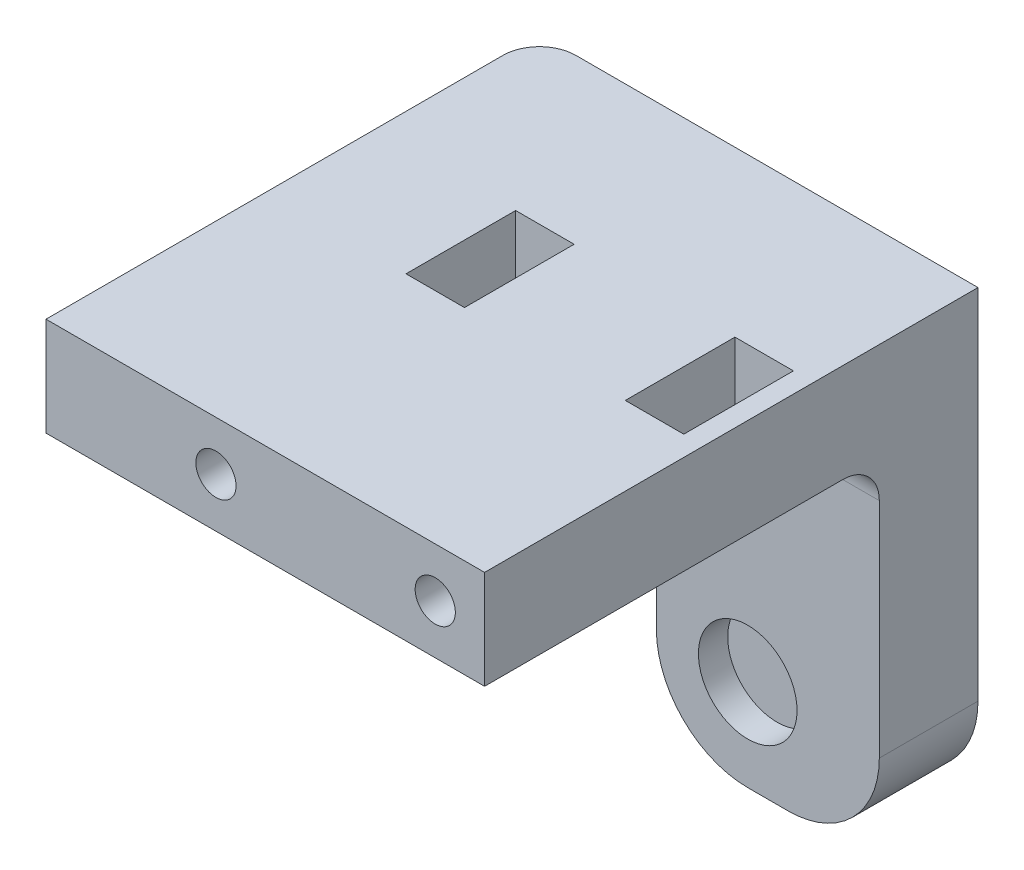
ISO-10303-21;
HEADER;
FILE_DESCRIPTION(('STEP AP214'),'2;1');
FILE_NAME('part.step','',(''),(''),'','','');
FILE_SCHEMA(('AUTOMOTIVE_DESIGN { 1 0 10303 214 1 1 1 1 }'));
ENDSEC;
DATA;
#1=APPLICATION_CONTEXT('core data for automotive mechanical design processes');
#2=APPLICATION_PROTOCOL_DEFINITION('international standard','automotive_design',2000,#1);
#3=PRODUCT_CONTEXT('',#1,'mechanical');
#4=PRODUCT('Part','Part','',(#3));
#5=PRODUCT_RELATED_PRODUCT_CATEGORY('part','',(#4));
#6=PRODUCT_DEFINITION_FORMATION('','',#4);
#7=PRODUCT_DEFINITION_CONTEXT('part definition',#1,'design');
#8=PRODUCT_DEFINITION('design','',#6,#7);
#9=PRODUCT_DEFINITION_SHAPE('','',#8);
#10=(LENGTH_UNIT() NAMED_UNIT(*) SI_UNIT(.MILLI.,.METRE.));
#11=(NAMED_UNIT(*) PLANE_ANGLE_UNIT() SI_UNIT($,.RADIAN.));
#12=(NAMED_UNIT(*) SI_UNIT($,.STERADIAN.) SOLID_ANGLE_UNIT());
#13=UNCERTAINTY_MEASURE_WITH_UNIT(LENGTH_MEASURE(1.E-05),#10,'distance_accuracy_value','');
#14=(GEOMETRIC_REPRESENTATION_CONTEXT(3) GLOBAL_UNCERTAINTY_ASSIGNED_CONTEXT((#13)) GLOBAL_UNIT_ASSIGNED_CONTEXT((#10,
#11,#12)) REPRESENTATION_CONTEXT('',''));
#15=CARTESIAN_POINT('',(0.,0.,0.));
#16=DIRECTION('',(0.,0.,1.));
#17=DIRECTION('',(1.,0.,0.));
#18=AXIS2_PLACEMENT_3D('',#15,#16,#17);
#19=CARTESIAN_POINT('',(-18.01,-6.05000000000001,-70.05));
#20=DIRECTION('',(0.,0.,-1.));
#21=DIRECTION('',(0.,-1.,0.));
#22=AXIS2_PLACEMENT_3D('',#19,#20,#21);
#23=PLANE('',#22);
#24=CARTESIAN_POINT('',(35.25,-12.8,-70.05));
#25=DIRECTION('',(0.,0.,1.));
#26=DIRECTION('',(0.,-1.,0.));
#27=AXIS2_PLACEMENT_3D('',#24,#25,#26);
#28=CIRCLE('',#27,2.74999999999999);
#29=CARTESIAN_POINT('',(35.25,-15.55,-70.05));
#30=VERTEX_POINT('',#29);
#31=EDGE_CURVE('E342',#30,#30,#28,.F.);
#32=ORIENTED_EDGE('',*,*,#31,.T.);
#33=EDGE_LOOP('',(#32));
#34=FACE_BOUND('',#33,.T.);
#35=CARTESIAN_POINT('',(5.25,-12.8,-70.05));
#36=DIRECTION('',(0.,0.,1.));
#37=DIRECTION('',(0.,-1.,0.));
#38=AXIS2_PLACEMENT_3D('',#35,#36,#37);
#39=CIRCLE('',#38,2.74999999999999);
#40=CARTESIAN_POINT('',(5.25,-15.55,-70.05));
#41=VERTEX_POINT('',#40);
#42=EDGE_CURVE('E377',#41,#41,#39,.F.);
#43=ORIENTED_EDGE('',*,*,#42,.T.);
#44=EDGE_LOOP('',(#43));
#45=FACE_BOUND('',#44,.T.);
#46=DIRECTION('',(-1.,0.,0.));
#47=VECTOR('',#46,1.);
#48=CARTESIAN_POINT('',(42.,-6.05000000000001,-70.05));
#49=LINE('',#48,#47);
#50=CARTESIAN_POINT('',(42.,-6.05000000000001,-70.05));
#51=VERTEX_POINT('',#50);
#52=CARTESIAN_POINT('',(-18.,-6.05000000000001,-70.05));
#53=VERTEX_POINT('',#52);
#54=EDGE_CURVE('E11',#51,#53,#49,.T.);
#55=ORIENTED_EDGE('',*,*,#54,.T.);
#56=DIRECTION('',(0.,-1.,0.));
#57=VECTOR('',#56,1.);
#58=CARTESIAN_POINT('',(-18.,-84.05,-70.05));
#59=LINE('',#58,#57);
#60=CARTESIAN_POINT('',(-18.,-19.55,-70.05));
#61=VERTEX_POINT('',#60);
#62=EDGE_CURVE('E35',#53,#61,#59,.T.);
#63=ORIENTED_EDGE('',*,*,#62,.T.);
#64=DIRECTION('',(1.,0.,0.));
#65=VECTOR('',#64,1.);
#66=CARTESIAN_POINT('',(0.,-19.55,-70.05));
#67=LINE('',#66,#65);
#68=CARTESIAN_POINT('',(42.,-19.55,-70.05));
#69=VERTEX_POINT('',#68);
#70=EDGE_CURVE('E276',#61,#69,#67,.T.);
#71=ORIENTED_EDGE('',*,*,#70,.T.);
#72=DIRECTION('',(0.,1.,0.));
#73=VECTOR('',#72,1.);
#74=CARTESIAN_POINT('',(42.,-26.05,-70.05));
#75=LINE('',#74,#73);
#76=EDGE_CURVE('E379',#69,#51,#75,.T.);
#77=ORIENTED_EDGE('',*,*,#76,.T.);
#78=EDGE_LOOP('',(#55,#63,#71,#77));
#79=FACE_BOUND('',#78,.T.);
#80=ADVANCED_FACE('F32',(#34,#45,#79),#23,.F.);
#81=CARTESIAN_POINT('',(24.,-55.05,-128.05));
#82=DIRECTION('',(0.,0.,1.));
#83=DIRECTION('',(1.,0.,0.));
#84=AXIS2_PLACEMENT_3D('',#81,#82,#83);
#85=PLANE('',#84);
#86=CARTESIAN_POINT('',(24.,-55.05,-128.05));
#87=DIRECTION('',(0.,0.,-1.));
#88=DIRECTION('',(1.,0.,0.));
#89=AXIS2_PLACEMENT_3D('',#86,#87,#88);
#90=CIRCLE('',#89,6.746875);
#91=CARTESIAN_POINT('',(30.746875,-55.05,-128.05));
#92=VERTEX_POINT('',#91);
#93=EDGE_CURVE('E246',#92,#92,#90,.T.);
#94=ORIENTED_EDGE('',*,*,#93,.F.);
#95=EDGE_LOOP('',(#94));
#96=FACE_BOUND('',#95,.T.);
#97=ADVANCED_FACE('F363',(#96),#85,.T.);
#98=CARTESIAN_POINT('',(24.,-55.05,-128.05));
#99=DIRECTION('',(0.,0.,1.));
#100=DIRECTION('',(1.,0.,0.));
#101=AXIS2_PLACEMENT_3D('',#98,#99,#100);
#102=CYLINDRICAL_SURFACE('',#101,6.746875);
#103=ORIENTED_EDGE('',*,*,#93,.T.);
#104=EDGE_LOOP('',(#103));
#105=FACE_BOUND('',#104,.T.);
#106=CARTESIAN_POINT('',(24.,-55.05,-124.05));
#107=DIRECTION('',(0.,0.,-1.));
#108=DIRECTION('',(1.,0.,0.));
#109=AXIS2_PLACEMENT_3D('',#106,#107,#108);
#110=CIRCLE('',#109,6.746875);
#111=CARTESIAN_POINT('',(30.746875,-55.05,-124.05));
#112=VERTEX_POINT('',#111);
#113=EDGE_CURVE('E245',#112,#112,#110,.T.);
#114=ORIENTED_EDGE('',*,*,#113,.F.);
#115=EDGE_LOOP('',(#114));
#116=FACE_BOUND('',#115,.T.);
#117=ADVANCED_FACE('F368',(#105,#116),#102,.F.);
#118=CARTESIAN_POINT('',(11.5,-67.55,-124.05));
#119=DIRECTION('',(0.,1.,0.));
#120=DIRECTION('',(-1.,0.,0.));
#121=AXIS2_PLACEMENT_3D('',#118,#119,#120);
#122=PLANE('',#121);
#123=DIRECTION('',(-1.,0.,0.));
#124=VECTOR('',#123,1.);
#125=CARTESIAN_POINT('',(11.5,-67.55,-137.55));
#126=LINE('',#125,#124);
#127=CARTESIAN_POINT('',(29.5,-67.55,-137.55));
#128=VERTEX_POINT('',#127);
#129=CARTESIAN_POINT('',(24.,-67.55,-137.55));
#130=VERTEX_POINT('',#129);
#131=EDGE_CURVE('E256',#128,#130,#126,.T.);
#132=ORIENTED_EDGE('',*,*,#131,.F.);
#133=DIRECTION('',(0.,0.,-1.));
#134=VECTOR('',#133,1.);
#135=CARTESIAN_POINT('',(29.5,-67.55,-124.05));
#136=LINE('',#135,#134);
#137=CARTESIAN_POINT('',(29.5,-67.55,-124.05));
#138=VERTEX_POINT('',#137);
#139=EDGE_CURVE('E295',#138,#128,#136,.T.);
#140=ORIENTED_EDGE('',*,*,#139,.F.);
#141=DIRECTION('',(-1.,0.,0.));
#142=VECTOR('',#141,1.);
#143=CARTESIAN_POINT('',(11.5,-67.55,-124.05));
#144=LINE('',#143,#142);
#145=CARTESIAN_POINT('',(24.,-67.55,-124.05));
#146=VERTEX_POINT('',#145);
#147=EDGE_CURVE('E259',#138,#146,#144,.T.);
#148=ORIENTED_EDGE('',*,*,#147,.T.);
#149=DIRECTION('',(0.,0.,-1.));
#150=VECTOR('',#149,1.);
#151=CARTESIAN_POINT('',(24.,-67.55,-124.05));
#152=LINE('',#151,#150);
#153=EDGE_CURVE('E298',#130,#146,#152,.F.);
#154=ORIENTED_EDGE('',*,*,#153,.F.);
#155=EDGE_LOOP('',(#132,#140,#148,#154));
#156=FACE_BOUND('',#155,.T.);
#157=ADVANCED_FACE('F409',(#156),#122,.F.);
#158=CARTESIAN_POINT('',(24.,-55.05,-124.05));
#159=DIRECTION('',(0.,0.,-1.));
#160=DIRECTION('',(-1.,0.,0.));
#161=AXIS2_PLACEMENT_3D('',#158,#159,#160);
#162=CYLINDRICAL_SURFACE('',#161,12.5);
#163=CARTESIAN_POINT('',(24.,-55.05,-124.05));
#164=DIRECTION('',(0.,0.,1.));
#165=DIRECTION('',(-1.,0.,0.));
#166=AXIS2_PLACEMENT_3D('',#163,#164,#165);
#167=CIRCLE('',#166,12.5);
#168=CARTESIAN_POINT('',(11.5,-55.05,-124.05));
#169=VERTEX_POINT('',#168);
#170=EDGE_CURVE('E303',#146,#169,#167,.F.);
#171=ORIENTED_EDGE('',*,*,#170,.T.);
#172=DIRECTION('',(0.,0.,-1.));
#173=VECTOR('',#172,1.);
#174=CARTESIAN_POINT('',(11.5,-55.05,-124.05));
#175=LINE('',#174,#173);
#176=CARTESIAN_POINT('',(11.5,-55.05,-137.55));
#177=VERTEX_POINT('',#176);
#178=EDGE_CURVE('E284',#169,#177,#175,.T.);
#179=ORIENTED_EDGE('',*,*,#178,.T.);
#180=CARTESIAN_POINT('',(24.,-55.05,-137.55));
#181=DIRECTION('',(0.,0.,-1.));
#182=DIRECTION('',(1.,0.,0.));
#183=AXIS2_PLACEMENT_3D('',#180,#181,#182);
#184=CIRCLE('',#183,12.5);
#185=EDGE_CURVE('E293',#177,#130,#184,.F.);
#186=ORIENTED_EDGE('',*,*,#185,.T.);
#187=ORIENTED_EDGE('',*,*,#153,.T.);
#188=EDGE_LOOP('',(#171,#179,#186,#187));
#189=FACE_BOUND('',#188,.T.);
#190=ADVANCED_FACE('F411',(#189),#162,.T.);
#191=CARTESIAN_POINT('',(11.5,-19.55,-124.05));
#192=DIRECTION('',(1.,0.,0.));
#193=DIRECTION('',(0.,0.,-1.));
#194=AXIS2_PLACEMENT_3D('',#191,#192,#193);
#195=PLANE('',#194);
#196=DIRECTION('',(0.,1.,0.));
#197=VECTOR('',#196,1.);
#198=CARTESIAN_POINT('',(11.5,-19.55,-137.55));
#199=LINE('',#198,#197);
#200=CARTESIAN_POINT('',(11.5,-32.05,-137.55));
#201=VERTEX_POINT('',#200);
#202=EDGE_CURVE('E249',#177,#201,#199,.T.);
#203=ORIENTED_EDGE('',*,*,#202,.F.);
#204=ORIENTED_EDGE('',*,*,#178,.F.);
#205=DIRECTION('',(0.,1.,0.));
#206=VECTOR('',#205,1.);
#207=CARTESIAN_POINT('',(11.5,-19.55,-124.05));
#208=LINE('',#207,#206);
#209=CARTESIAN_POINT('',(11.5,-32.05,-124.05));
#210=VERTEX_POINT('',#209);
#211=EDGE_CURVE('E252',#169,#210,#208,.T.);
#212=ORIENTED_EDGE('',*,*,#211,.T.);
#213=DIRECTION('',(0.,0.,-1.));
#214=VECTOR('',#213,1.);
#215=CARTESIAN_POINT('',(11.5,-32.05,-124.05));
#216=LINE('',#215,#214);
#217=EDGE_CURVE('E287',#201,#210,#216,.F.);
#218=ORIENTED_EDGE('',*,*,#217,.F.);
#219=EDGE_LOOP('',(#203,#204,#212,#218));
#220=FACE_BOUND('',#219,.T.);
#221=ADVANCED_FACE('F414',(#220),#195,.F.);
#222=CARTESIAN_POINT('',(31.25,-84.05,-115.05));
#223=DIRECTION('',(1.,0.,0.));
#224=DIRECTION('',(0.,1.,0.));
#225=AXIS2_PLACEMENT_3D('',#222,#223,#224);
#226=PLANE('',#225);
#227=DIRECTION('',(0.,1.,0.));
#228=VECTOR('',#227,1.);
#229=CARTESIAN_POINT('',(31.25,-84.05,-100.05));
#230=LINE('',#229,#228);
#231=CARTESIAN_POINT('',(31.25,-19.55,-100.05));
#232=VERTEX_POINT('',#231);
#233=CARTESIAN_POINT('',(31.25,-6.05000000000002,-100.05));
#234=VERTEX_POINT('',#233);
#235=EDGE_CURVE('E200',#232,#234,#230,.T.);
#236=ORIENTED_EDGE('',*,*,#235,.F.);
#237=DIRECTION('',(0.,0.,-1.));
#238=VECTOR('',#237,1.);
#239=CARTESIAN_POINT('',(31.25,-19.55,-55.05));
#240=LINE('',#239,#238);
#241=CARTESIAN_POINT('',(31.25,-19.55,-115.05));
#242=VERTEX_POINT('',#241);
#243=EDGE_CURVE('E239',#232,#242,#240,.T.);
#244=ORIENTED_EDGE('',*,*,#243,.T.);
#245=DIRECTION('',(0.,1.,0.));
#246=VECTOR('',#245,1.);
#247=CARTESIAN_POINT('',(31.25,-84.05,-115.05));
#248=LINE('',#247,#246);
#249=CARTESIAN_POINT('',(31.25,-6.05000000000003,-115.05));
#250=VERTEX_POINT('',#249);
#251=EDGE_CURVE('E195',#242,#250,#248,.T.);
#252=ORIENTED_EDGE('',*,*,#251,.T.);
#253=DIRECTION('',(0.,0.,1.));
#254=VECTOR('',#253,1.);
#255=CARTESIAN_POINT('',(31.25,-6.05000000000003,-115.05));
#256=LINE('',#255,#254);
#257=EDGE_CURVE('E176',#250,#234,#256,.T.);
#258=ORIENTED_EDGE('',*,*,#257,.T.);
#259=EDGE_LOOP('',(#236,#244,#252,#258));
#260=FACE_BOUND('',#259,.T.);
#261=ADVANCED_FACE('F417',(#260),#226,.T.);
#262=CARTESIAN_POINT('',(39.25,-84.05,-100.05));
#263=DIRECTION('',(0.,0.,-1.));
#264=DIRECTION('',(0.,-1.,0.));
#265=AXIS2_PLACEMENT_3D('',#262,#263,#264);
#266=PLANE('',#265);
#267=DIRECTION('',(0.,1.,0.));
#268=VECTOR('',#267,1.);
#269=CARTESIAN_POINT('',(39.25,-84.05,-100.05));
#270=LINE('',#269,#268);
#271=CARTESIAN_POINT('',(39.25,-19.55,-100.05));
#272=VERTEX_POINT('',#271);
#273=CARTESIAN_POINT('',(39.25,-6.05000000000001,-100.05));
#274=VERTEX_POINT('',#273);
#275=EDGE_CURVE('E188',#272,#274,#270,.T.);
#276=ORIENTED_EDGE('',*,*,#275,.F.);
#277=DIRECTION('',(-1.,0.,0.));
#278=VECTOR('',#277,1.);
#279=CARTESIAN_POINT('',(0.,-19.55,-100.05));
#280=LINE('',#279,#278);
#281=EDGE_CURVE('E198',#272,#232,#280,.T.);
#282=ORIENTED_EDGE('',*,*,#281,.T.);
#283=ORIENTED_EDGE('',*,*,#235,.T.);
#284=DIRECTION('',(1.,0.,0.));
#285=VECTOR('',#284,1.);
#286=CARTESIAN_POINT('',(39.25,-6.05000000000002,-100.05));
#287=LINE('',#286,#285);
#288=EDGE_CURVE('E668',#234,#274,#287,.T.);
#289=ORIENTED_EDGE('',*,*,#288,.T.);
#290=EDGE_LOOP('',(#276,#282,#283,#289));
#291=FACE_BOUND('',#290,.T.);
#292=CARTESIAN_POINT('',(35.25,-12.8,-100.05));
#293=DIRECTION('',(0.,0.,1.));
#294=DIRECTION('',(0.,-1.,0.));
#295=AXIS2_PLACEMENT_3D('',#292,#293,#294);
#296=CIRCLE('',#295,2.74999999999999);
#297=CARTESIAN_POINT('',(35.25,-15.55,-100.05));
#298=VERTEX_POINT('',#297);
#299=EDGE_CURVE('E194',#298,#298,#296,.F.);
#300=ORIENTED_EDGE('',*,*,#299,.F.);
#301=EDGE_LOOP('',(#300));
#302=FACE_BOUND('',#301,.T.);
#303=ADVANCED_FACE('F423',(#291,#302),#266,.T.);
#304=CARTESIAN_POINT('',(35.25,-12.8,-55.05));
#305=DIRECTION('',(0.,0.,1.));
#306=DIRECTION('',(0.,1.,0.));
#307=AXIS2_PLACEMENT_3D('',#304,#305,#306);
#308=CYLINDRICAL_SURFACE('',#307,2.74999999999999);
#309=ORIENTED_EDGE('',*,*,#31,.F.);
#310=EDGE_LOOP('',(#309));
#311=FACE_BOUND('',#310,.T.);
#312=ORIENTED_EDGE('',*,*,#299,.T.);
#313=EDGE_LOOP('',(#312));
#314=FACE_BOUND('',#313,.T.);
#315=ADVANCED_FACE('F468',(#311,#314),#308,.F.);
#316=CARTESIAN_POINT('',(39.25,-84.05,-115.05));
#317=DIRECTION('',(-1.,0.,0.));
#318=DIRECTION('',(0.,-1.,0.));
#319=AXIS2_PLACEMENT_3D('',#316,#317,#318);
#320=PLANE('',#319);
#321=DIRECTION('',(0.,1.,0.));
#322=VECTOR('',#321,1.);
#323=CARTESIAN_POINT('',(39.25,-84.05,-115.05));
#324=LINE('',#323,#322);
#325=CARTESIAN_POINT('',(39.25,-19.55,-115.05));
#326=VERTEX_POINT('',#325);
#327=CARTESIAN_POINT('',(39.25,-6.05000000000003,-115.05));
#328=VERTEX_POINT('',#327);
#329=EDGE_CURVE('E186',#326,#328,#324,.T.);
#330=ORIENTED_EDGE('',*,*,#329,.F.);
#331=DIRECTION('',(0.,0.,1.));
#332=VECTOR('',#331,1.);
#333=CARTESIAN_POINT('',(39.25,-19.55,-55.05));
#334=LINE('',#333,#332);
#335=EDGE_CURVE('E243',#326,#272,#334,.T.);
#336=ORIENTED_EDGE('',*,*,#335,.T.);
#337=ORIENTED_EDGE('',*,*,#275,.T.);
#338=DIRECTION('',(0.,0.,-1.));
#339=VECTOR('',#338,1.);
#340=CARTESIAN_POINT('',(39.25,-6.05000000000003,-115.05));
#341=LINE('',#340,#339);
#342=EDGE_CURVE('E173',#274,#328,#341,.T.);
#343=ORIENTED_EDGE('',*,*,#342,.T.);
#344=EDGE_LOOP('',(#330,#336,#337,#343));
#345=FACE_BOUND('',#344,.T.);
#346=ADVANCED_FACE('F185',(#345),#320,.T.);
#347=CARTESIAN_POINT('',(39.25,-84.05,-115.05));
#348=DIRECTION('',(0.,0.,1.));
#349=DIRECTION('',(0.,1.,0.));
#350=AXIS2_PLACEMENT_3D('',#347,#348,#349);
#351=PLANE('',#350);
#352=ORIENTED_EDGE('',*,*,#251,.F.);
#353=DIRECTION('',(1.,0.,0.));
#354=VECTOR('',#353,1.);
#355=CARTESIAN_POINT('',(0.,-19.55,-115.05));
#356=LINE('',#355,#354);
#357=EDGE_CURVE('E192',#242,#326,#356,.T.);
#358=ORIENTED_EDGE('',*,*,#357,.T.);
#359=ORIENTED_EDGE('',*,*,#329,.T.);
#360=DIRECTION('',(-1.,0.,0.));
#361=VECTOR('',#360,1.);
#362=CARTESIAN_POINT('',(39.25,-6.05000000000003,-115.05));
#363=LINE('',#362,#361);
#364=EDGE_CURVE('E170',#328,#250,#363,.T.);
#365=ORIENTED_EDGE('',*,*,#364,.T.);
#366=EDGE_LOOP('',(#352,#358,#359,#365));
#367=FACE_BOUND('',#366,.T.);
#368=ADVANCED_FACE('F191',(#367),#351,.T.);
#369=CARTESIAN_POINT('',(9.25,-84.05,-115.05));
#370=DIRECTION('',(-1.,0.,0.));
#371=DIRECTION('',(0.,0.,1.));
#372=AXIS2_PLACEMENT_3D('',#369,#370,#371);
#373=PLANE('',#372);
#374=DIRECTION('',(0.,1.,0.));
#375=VECTOR('',#374,1.);
#376=CARTESIAN_POINT('',(9.25,-84.05,-115.05));
#377=LINE('',#376,#375);
#378=CARTESIAN_POINT('',(9.25,-19.55,-115.05));
#379=VERTEX_POINT('',#378);
#380=CARTESIAN_POINT('',(9.25,-6.05000000000003,-115.05));
#381=VERTEX_POINT('',#380);
#382=EDGE_CURVE('E218',#379,#381,#377,.T.);
#383=ORIENTED_EDGE('',*,*,#382,.F.);
#384=DIRECTION('',(0.,0.,1.));
#385=VECTOR('',#384,1.);
#386=CARTESIAN_POINT('',(9.24999999999998,-19.55,-55.05));
#387=LINE('',#386,#385);
#388=CARTESIAN_POINT('',(9.24999999999999,-19.55,-100.05));
#389=VERTEX_POINT('',#388);
#390=EDGE_CURVE('E234',#379,#389,#387,.T.);
#391=ORIENTED_EDGE('',*,*,#390,.T.);
#392=DIRECTION('',(0.,1.,0.));
#393=VECTOR('',#392,1.);
#394=CARTESIAN_POINT('',(9.24999999999999,-84.05,-100.05));
#395=LINE('',#394,#393);
#396=CARTESIAN_POINT('',(9.24999999999999,-6.05000000000002,-100.05));
#397=VERTEX_POINT('',#396);
#398=EDGE_CURVE('E221',#389,#397,#395,.T.);
#399=ORIENTED_EDGE('',*,*,#398,.T.);
#400=DIRECTION('',(0.,0.,-1.));
#401=VECTOR('',#400,1.);
#402=CARTESIAN_POINT('',(9.25,-6.05000000000003,-115.05));
#403=LINE('',#402,#401);
#404=EDGE_CURVE('E209',#397,#381,#403,.T.);
#405=ORIENTED_EDGE('',*,*,#404,.T.);
#406=EDGE_LOOP('',(#383,#391,#399,#405));
#407=FACE_BOUND('',#406,.T.);
#408=ADVANCED_FACE('F454',(#407),#373,.T.);
#409=CARTESIAN_POINT('',(1.25,-84.05,-115.05));
#410=DIRECTION('',(0.,0.,1.));
#411=DIRECTION('',(0.,1.,0.));
#412=AXIS2_PLACEMENT_3D('',#409,#410,#411);
#413=PLANE('',#412);
#414=DIRECTION('',(0.,1.,0.));
#415=VECTOR('',#414,1.);
#416=CARTESIAN_POINT('',(1.25,-84.05,-115.05));
#417=LINE('',#416,#415);
#418=CARTESIAN_POINT('',(1.25,-19.55,-115.05));
#419=VERTEX_POINT('',#418);
#420=CARTESIAN_POINT('',(1.25,-6.05000000000003,-115.05));
#421=VERTEX_POINT('',#420);
#422=EDGE_CURVE('E215',#419,#421,#417,.T.);
#423=ORIENTED_EDGE('',*,*,#422,.F.);
#424=DIRECTION('',(1.,0.,0.));
#425=VECTOR('',#424,1.);
#426=CARTESIAN_POINT('',(0.,-19.55,-115.05));
#427=LINE('',#426,#425);
#428=EDGE_CURVE('E232',#419,#379,#427,.T.);
#429=ORIENTED_EDGE('',*,*,#428,.T.);
#430=ORIENTED_EDGE('',*,*,#382,.T.);
#431=DIRECTION('',(-1.,0.,0.));
#432=VECTOR('',#431,1.);
#433=CARTESIAN_POINT('',(1.25,-6.05000000000003,-115.05));
#434=LINE('',#433,#432);
#435=EDGE_CURVE('E212',#381,#421,#434,.T.);
#436=ORIENTED_EDGE('',*,*,#435,.T.);
#437=EDGE_LOOP('',(#423,#429,#430,#436));
#438=FACE_BOUND('',#437,.T.);
#439=ADVANCED_FACE('F445',(#438),#413,.T.);
#440=CARTESIAN_POINT('',(1.25,-84.05,-115.05));
#441=DIRECTION('',(1.,0.,0.));
#442=DIRECTION('',(0.,0.,-1.));
#443=AXIS2_PLACEMENT_3D('',#440,#441,#442);
#444=PLANE('',#443);
#445=DIRECTION('',(0.,1.,0.));
#446=VECTOR('',#445,1.);
#447=CARTESIAN_POINT('',(1.25,-84.05,-100.05));
#448=LINE('',#447,#446);
#449=CARTESIAN_POINT('',(1.25,-19.55,-100.05));
#450=VERTEX_POINT('',#449);
#451=CARTESIAN_POINT('',(1.25,-6.05000000000002,-100.05));
#452=VERTEX_POINT('',#451);
#453=EDGE_CURVE('E189',#450,#452,#448,.T.);
#454=ORIENTED_EDGE('',*,*,#453,.F.);
#455=DIRECTION('',(0.,0.,-1.));
#456=VECTOR('',#455,1.);
#457=CARTESIAN_POINT('',(1.25000000000002,-19.55,-55.05));
#458=LINE('',#457,#456);
#459=EDGE_CURVE('E237',#450,#419,#458,.T.);
#460=ORIENTED_EDGE('',*,*,#459,.T.);
#461=ORIENTED_EDGE('',*,*,#422,.T.);
#462=DIRECTION('',(0.,0.,1.));
#463=VECTOR('',#462,1.);
#464=CARTESIAN_POINT('',(1.25,-6.05000000000003,-115.05));
#465=LINE('',#464,#463);
#466=EDGE_CURVE('E204',#421,#452,#465,.T.);
#467=ORIENTED_EDGE('',*,*,#466,.T.);
#468=EDGE_LOOP('',(#454,#460,#461,#467));
#469=FACE_BOUND('',#468,.T.);
#470=ADVANCED_FACE('F447',(#469),#444,.T.);
#471=CARTESIAN_POINT('',(1.25,-84.05,-100.05));
#472=DIRECTION('',(0.,0.,-1.));
#473=DIRECTION('',(0.,-1.,0.));
#474=AXIS2_PLACEMENT_3D('',#471,#472,#473);
#475=PLANE('',#474);
#476=ORIENTED_EDGE('',*,*,#398,.F.);
#477=DIRECTION('',(-1.,0.,0.));
#478=VECTOR('',#477,1.);
#479=CARTESIAN_POINT('',(0.,-19.55,-100.05));
#480=LINE('',#479,#478);
#481=EDGE_CURVE('E230',#389,#450,#480,.T.);
#482=ORIENTED_EDGE('',*,*,#481,.T.);
#483=ORIENTED_EDGE('',*,*,#453,.T.);
#484=DIRECTION('',(1.,0.,0.));
#485=VECTOR('',#484,1.);
#486=CARTESIAN_POINT('',(1.25,-6.05000000000002,-100.05));
#487=LINE('',#486,#485);
#488=EDGE_CURVE('E207',#452,#397,#487,.T.);
#489=ORIENTED_EDGE('',*,*,#488,.T.);
#490=EDGE_LOOP('',(#476,#482,#483,#489));
#491=FACE_BOUND('',#490,.T.);
#492=CARTESIAN_POINT('',(5.25,-12.8,-100.05));
#493=DIRECTION('',(0.,0.,1.));
#494=DIRECTION('',(0.,-1.,0.));
#495=AXIS2_PLACEMENT_3D('',#492,#493,#494);
#496=CIRCLE('',#495,2.74999999999999);
#497=CARTESIAN_POINT('',(5.25,-15.55,-100.05));
#498=VERTEX_POINT('',#497);
#499=EDGE_CURVE('E227',#498,#498,#496,.F.);
#500=ORIENTED_EDGE('',*,*,#499,.F.);
#501=EDGE_LOOP('',(#500));
#502=FACE_BOUND('',#501,.T.);
#503=ADVANCED_FACE('F456',(#491,#502),#475,.T.);
#504=CARTESIAN_POINT('',(5.25,-12.8,-55.05));
#505=DIRECTION('',(0.,0.,1.));
#506=DIRECTION('',(0.,1.,0.));
#507=AXIS2_PLACEMENT_3D('',#504,#505,#506);
#508=CYLINDRICAL_SURFACE('',#507,2.74999999999999);
#509=ORIENTED_EDGE('',*,*,#42,.F.);
#510=EDGE_LOOP('',(#509));
#511=FACE_BOUND('',#510,.T.);
#512=ORIENTED_EDGE('',*,*,#499,.T.);
#513=EDGE_LOOP('',(#512));
#514=FACE_BOUND('',#513,.T.);
#515=ADVANCED_FACE('F360',(#511,#514),#508,.F.);
#516=CARTESIAN_POINT('',(-0.999999999999996,-32.05,-55.05));
#517=DIRECTION('',(0.,0.,-1.));
#518=DIRECTION('',(-1.,0.,0.));
#519=AXIS2_PLACEMENT_3D('',#516,#517,#518);
#520=CYLINDRICAL_SURFACE('',#519,12.5);
#521=CARTESIAN_POINT('',(-1.00000000000001,-32.05,-124.05));
#522=DIRECTION('',(0.,0.,1.));
#523=DIRECTION('',(-1.,0.,0.));
#524=AXIS2_PLACEMENT_3D('',#521,#522,#523);
#525=CIRCLE('',#524,12.5);
#526=CARTESIAN_POINT('',(8.99999999999999,-24.55,-124.05));
#527=VERTEX_POINT('',#526);
#528=EDGE_CURVE('E310',#210,#527,#525,.T.);
#529=ORIENTED_EDGE('',*,*,#528,.T.);
#530=CARTESIAN_POINT('',(8.99999999999999,-24.55,-124.05));
#531=CARTESIAN_POINT('',(8.87177041220947,-24.378964837514,-124.049983130692));
#532=CARTESIAN_POINT('',(8.73919480190746,-24.2113958439968,-124.041228958009));
#533=CARTESIAN_POINT('',(8.4666819699711,-23.8844078798889,-124.008222778292));
#534=CARTESIAN_POINT('',(8.32675786378988,-23.7249753276561,-123.983997575113));
#535=CARTESIAN_POINT('',(8.04178852632988,-23.4163541505536,-123.922307131494));
#536=CARTESIAN_POINT('',(7.89680461103692,-23.2670825627194,-123.884969923145));
#537=CARTESIAN_POINT('',(7.60131636745874,-22.9775047500209,-123.798694219678));
#538=CARTESIAN_POINT('',(7.45080884785534,-22.8372038406133,-123.749748925758));
#539=CARTESIAN_POINT('',(7.08027453395445,-22.5083090544291,-123.618890217963));
#540=CARTESIAN_POINT('',(6.85783917712022,-22.3244738214263,-123.531798975948));
#541=CARTESIAN_POINT('',(6.4054492630776,-21.9757275426022,-123.340996078189));
#542=CARTESIAN_POINT('',(6.17549282886925,-21.8108212678179,-123.23728024794));
#543=CARTESIAN_POINT('',(5.70826187118503,-21.4987636829634,-123.015700476298));
#544=CARTESIAN_POINT('',(5.47095303059885,-21.351719249033,-122.897759052423));
#545=CARTESIAN_POINT('',(4.99153354623697,-21.0760305603808,-122.650803050037));
#546=CARTESIAN_POINT('',(4.74942281241361,-20.9473866510874,-122.521788263723));
#547=CARTESIAN_POINT('',(4.16015557528724,-20.6583073041349,-122.199459169055));
#548=CARTESIAN_POINT('',(3.811054904838,-20.5067967755807,-122.001658860056));
#549=CARTESIAN_POINT('',(3.10726206142142,-20.2380405710844,-121.592998277194));
#550=CARTESIAN_POINT('',(2.75256722443477,-20.120811773763,-121.382131631825));
#551=CARTESIAN_POINT('',(2.04010729381891,-19.9196875360659,-120.951713841682));
#552=CARTESIAN_POINT('',(1.68234973939806,-19.8357260449837,-120.732180866733));
#553=CARTESIAN_POINT('',(0.964585739580995,-19.6999504205597,-120.287359396961));
#554=CARTESIAN_POINT('',(0.604580585121185,-19.6481192906348,-120.062074010879));
#555=CARTESIAN_POINT('',(0.0400202168861201,-19.5916542403883,-119.707022109672));
#556=CARTESIAN_POINT('',(-0.164159503378895,-19.5762989929228,-119.578254410836));
#557=CARTESIAN_POINT('',(-0.572601436741762,-19.5556368629741,-119.320305061108));
#558=CARTESIAN_POINT('',(-0.776863495397228,-19.5503230458351,-119.191123757656));
#559=CARTESIAN_POINT('',(-0.987401206802896,-19.5500047624691,-119.05796817665));
#560=CARTESIAN_POINT('',(-0.993700616699642,-19.5500000006449,-119.05398407982));
#561=CARTESIAN_POINT('',(-1.00000000000001,-19.55,-119.05));
#562=B_SPLINE_CURVE_WITH_KNOTS('',3,(#530,#531,#532,#533,#534,#535,#536,#537,#538,#539,#540,
#541,#542,#543,#544,#545,#546,#547,#548,#549,#550,#551,#552,#553,#554,#555,#556,#557,#558,#559,
#560,#561),.UNSPECIFIED.,.F.,.F.,(4,2,2,2,2,2,2,2,2,2,2,2,2,2,2,4),(0.,0.640808492489443,
1.28050977278769,1.91413083670816,2.54812393007428,3.45103882057657,4.35418079302726,
5.26248516341822,6.17080658295034,7.45562911653125,8.74108317193324,10.0239720724746,
11.3061817594764,12.031654241701,12.7566255260943,12.7789862104339),.UNSPECIFIED.);
#563=CARTESIAN_POINT('',(-1.00000000000001,-19.55,-119.05));
#564=VERTEX_POINT('',#563);
#565=EDGE_CURVE('E333',#564,#527,#562,.F.);
#566=ORIENTED_EDGE('',*,*,#565,.F.);
#567=DIRECTION('',(0.,0.,-1.));
#568=VECTOR('',#567,1.);
#569=CARTESIAN_POINT('',(-0.999999999999996,-19.55,-55.05));
#570=LINE('',#569,#568);
#571=CARTESIAN_POINT('',(-1.,-19.55,-137.55));
#572=VERTEX_POINT('',#571);
#573=EDGE_CURVE('E281',#564,#572,#570,.T.);
#574=ORIENTED_EDGE('',*,*,#573,.T.);
#575=CARTESIAN_POINT('',(-1.00000000000001,-32.05,-137.55));
#576=DIRECTION('',(0.,0.,-1.));
#577=DIRECTION('',(1.,0.,0.));
#578=AXIS2_PLACEMENT_3D('',#575,#576,#577);
#579=CIRCLE('',#578,12.5);
#580=EDGE_CURVE('E308',#572,#201,#579,.T.);
#581=ORIENTED_EDGE('',*,*,#580,.T.);
#582=ORIENTED_EDGE('',*,*,#217,.T.);
#583=EDGE_LOOP('',(#529,#566,#574,#581,#582));
#584=FACE_BOUND('',#583,.T.);
#585=ADVANCED_FACE('F343',(#584),#520,.F.);
#586=CARTESIAN_POINT('',(-13.,-84.05,-132.55));
#587=DIRECTION('',(0.,1.,0.));
#588=DIRECTION('',(-1.,0.,0.));
#589=AXIS2_PLACEMENT_3D('',#586,#587,#588);
#590=CYLINDRICAL_SURFACE('',#589,5.);
#591=CARTESIAN_POINT('',(-13.,-19.55,-132.55));
#592=DIRECTION('',(0.,1.,0.));
#593=DIRECTION('',(1.,0.,0.));
#594=AXIS2_PLACEMENT_3D('',#591,#592,#593);
#595=CIRCLE('',#594,5.);
#596=CARTESIAN_POINT('',(-13.,-19.55,-137.55));
#597=VERTEX_POINT('',#596);
#598=CARTESIAN_POINT('',(-18.,-19.55,-132.55));
#599=VERTEX_POINT('',#598);
#600=EDGE_CURVE('E316',#597,#599,#595,.T.);
#601=ORIENTED_EDGE('',*,*,#600,.T.);
#602=DIRECTION('',(0.,1.,0.));
#603=VECTOR('',#602,1.);
#604=CARTESIAN_POINT('',(-18.,-84.05,-132.55));
#605=LINE('',#604,#603);
#606=CARTESIAN_POINT('',(-18.,-6.05000000000003,-132.55));
#607=VERTEX_POINT('',#606);
#608=EDGE_CURVE('E321',#599,#607,#605,.T.);
#609=ORIENTED_EDGE('',*,*,#608,.T.);
#610=CARTESIAN_POINT('',(-13.,-6.05000000000002,-132.55));
#611=DIRECTION('',(0.,1.,0.));
#612=DIRECTION('',(1.,0.,0.));
#613=AXIS2_PLACEMENT_3D('',#610,#611,#612);
#614=CIRCLE('',#613,5.);
#615=CARTESIAN_POINT('',(-13.,-6.05000000000004,-137.55));
#616=VERTEX_POINT('',#615);
#617=EDGE_CURVE('E324',#607,#616,#614,.F.);
#618=ORIENTED_EDGE('',*,*,#617,.T.);
#619=DIRECTION('',(0.,1.,0.));
#620=VECTOR('',#619,1.);
#621=CARTESIAN_POINT('',(-13.,-19.55,-137.55));
#622=LINE('',#621,#620);
#623=EDGE_CURVE('E327',#616,#597,#622,.F.);
#624=ORIENTED_EDGE('',*,*,#623,.T.);
#625=EDGE_LOOP('',(#601,#609,#618,#624));
#626=FACE_BOUND('',#625,.T.);
#627=ADVANCED_FACE('F352',(#626),#590,.T.);
#628=CARTESIAN_POINT('',(0.,-24.55,-119.05));
#629=DIRECTION('',(1.,0.,0.));
#630=DIRECTION('',(0.,0.,-1.));
#631=AXIS2_PLACEMENT_3D('',#628,#629,#630);
#632=CYLINDRICAL_SURFACE('',#631,5.);
#633=ORIENTED_EDGE('',*,*,#565,.T.);
#634=DIRECTION('',(1.,0.,0.));
#635=VECTOR('',#634,1.);
#636=CARTESIAN_POINT('',(0.,-24.55,-124.05));
#637=LINE('',#636,#635);
#638=CARTESIAN_POINT('',(42.,-24.55,-124.05));
#639=VERTEX_POINT('',#638);
#640=EDGE_CURVE('E313',#527,#639,#637,.T.);
#641=ORIENTED_EDGE('',*,*,#640,.T.);
#642=CARTESIAN_POINT('',(42.,-24.55,-119.05));
#643=DIRECTION('',(1.,0.,0.));
#644=DIRECTION('',(0.,-1.,0.));
#645=AXIS2_PLACEMENT_3D('',#642,#643,#644);
#646=CIRCLE('',#645,5.);
#647=CARTESIAN_POINT('',(42.,-19.55,-119.05));
#648=VERTEX_POINT('',#647);
#649=EDGE_CURVE('E330',#639,#648,#646,.T.);
#650=ORIENTED_EDGE('',*,*,#649,.T.);
#651=DIRECTION('',(1.,0.,0.));
#652=VECTOR('',#651,1.);
#653=CARTESIAN_POINT('',(0.,-19.55,-119.05));
#654=LINE('',#653,#652);
#655=EDGE_CURVE('E319',#648,#564,#654,.F.);
#656=ORIENTED_EDGE('',*,*,#655,.T.);
#657=EDGE_LOOP('',(#633,#641,#650,#656));
#658=FACE_BOUND('',#657,.T.);
#659=ADVANCED_FACE('F347',(#658),#632,.F.);
#660=CARTESIAN_POINT('',(0.,-55.05,-124.05));
#661=DIRECTION('',(0.,0.,-1.));
#662=DIRECTION('',(-1.,0.,0.));
#663=AXIS2_PLACEMENT_3D('',#660,#661,#662);
#664=PLANE('',#663);
#665=ORIENTED_EDGE('',*,*,#113,.T.);
#666=EDGE_LOOP('',(#665));
#667=FACE_BOUND('',#666,.T.);
#668=ORIENTED_EDGE('',*,*,#528,.F.);
#669=ORIENTED_EDGE('',*,*,#211,.F.);
#670=ORIENTED_EDGE('',*,*,#170,.F.);
#671=ORIENTED_EDGE('',*,*,#147,.F.);
#672=CARTESIAN_POINT('',(29.5,-55.05,-124.05));
#673=DIRECTION('',(0.,0.,1.));
#674=DIRECTION('',(-1.,0.,0.));
#675=AXIS2_PLACEMENT_3D('',#672,#673,#674);
#676=CIRCLE('',#675,12.5);
#677=CARTESIAN_POINT('',(42.,-55.05,-124.05));
#678=VERTEX_POINT('',#677);
#679=EDGE_CURVE('E301',#678,#138,#676,.F.);
#680=ORIENTED_EDGE('',*,*,#679,.F.);
#681=DIRECTION('',(0.,-1.,0.));
#682=VECTOR('',#681,1.);
#683=CARTESIAN_POINT('',(42.,-19.55,-124.05));
#684=LINE('',#683,#682);
#685=EDGE_CURVE('E255',#639,#678,#684,.T.);
#686=ORIENTED_EDGE('',*,*,#685,.F.);
#687=ORIENTED_EDGE('',*,*,#640,.F.);
#688=EDGE_LOOP('',(#668,#669,#670,#671,#680,#686,#687));
#689=FACE_BOUND('',#688,.T.);
#690=ADVANCED_FACE('F351',(#667,#689),#664,.F.);
#691=CARTESIAN_POINT('',(29.5,-55.05,-124.05));
#692=DIRECTION('',(0.,0.,-1.));
#693=DIRECTION('',(0.,-1.,0.));
#694=AXIS2_PLACEMENT_3D('',#691,#692,#693);
#695=CYLINDRICAL_SURFACE('',#694,12.5);
#696=ORIENTED_EDGE('',*,*,#679,.T.);
#697=ORIENTED_EDGE('',*,*,#139,.T.);
#698=CARTESIAN_POINT('',(29.5,-55.05,-137.55));
#699=DIRECTION('',(0.,0.,-1.));
#700=DIRECTION('',(1.,0.,0.));
#701=AXIS2_PLACEMENT_3D('',#698,#699,#700);
#702=CIRCLE('',#701,12.5);
#703=CARTESIAN_POINT('',(42.,-55.05,-137.55));
#704=VERTEX_POINT('',#703);
#705=EDGE_CURVE('E290',#128,#704,#702,.F.);
#706=ORIENTED_EDGE('',*,*,#705,.T.);
#707=DIRECTION('',(0.,0.,-1.));
#708=VECTOR('',#707,1.);
#709=CARTESIAN_POINT('',(42.,-55.05,-70.05));
#710=LINE('',#709,#708);
#711=EDGE_CURVE('E306',#704,#678,#710,.F.);
#712=ORIENTED_EDGE('',*,*,#711,.T.);
#713=EDGE_LOOP('',(#696,#697,#706,#712));
#714=FACE_BOUND('',#713,.T.);
#715=ADVANCED_FACE('F354',(#714),#695,.T.);
#716=CARTESIAN_POINT('',(42.,-19.55,-137.55));
#717=DIRECTION('',(0.,0.,1.));
#718=DIRECTION('',(1.,0.,0.));
#719=AXIS2_PLACEMENT_3D('',#716,#717,#718);
#720=PLANE('',#719);
#721=DIRECTION('',(-1.,0.,0.));
#722=VECTOR('',#721,1.);
#723=CARTESIAN_POINT('',(42.,-6.05000000000004,-137.55));
#724=LINE('',#723,#722);
#725=CARTESIAN_POINT('',(42.,-6.05000000000004,-137.55));
#726=VERTEX_POINT('',#725);
#727=EDGE_CURVE('E262',#726,#616,#724,.T.);
#728=ORIENTED_EDGE('',*,*,#727,.F.);
#729=DIRECTION('',(0.,1.,0.));
#730=VECTOR('',#729,1.);
#731=CARTESIAN_POINT('',(42.,-19.55,-137.55));
#732=LINE('',#731,#730);
#733=EDGE_CURVE('E273',#704,#726,#732,.T.);
#734=ORIENTED_EDGE('',*,*,#733,.F.);
#735=ORIENTED_EDGE('',*,*,#705,.F.);
#736=ORIENTED_EDGE('',*,*,#131,.T.);
#737=ORIENTED_EDGE('',*,*,#185,.F.);
#738=ORIENTED_EDGE('',*,*,#202,.T.);
#739=ORIENTED_EDGE('',*,*,#580,.F.);
#740=DIRECTION('',(-1.,0.,0.));
#741=VECTOR('',#740,1.);
#742=CARTESIAN_POINT('',(42.,-19.55,-137.55));
#743=LINE('',#742,#741);
#744=EDGE_CURVE('E269',#572,#597,#743,.T.);
#745=ORIENTED_EDGE('',*,*,#744,.T.);
#746=ORIENTED_EDGE('',*,*,#623,.F.);
#747=EDGE_LOOP('',(#728,#734,#735,#736,#737,#738,#739,#745,#746));
#748=FACE_BOUND('',#747,.T.);
#749=ADVANCED_FACE('F385',(#748),#720,.F.);
#750=CARTESIAN_POINT('',(42.,-6.05000000000001,-70.05));
#751=DIRECTION('',(0.,-1.,0.));
#752=DIRECTION('',(1.,0.,0.));
#753=AXIS2_PLACEMENT_3D('',#750,#751,#752);
#754=PLANE('',#753);
#755=ORIENTED_EDGE('',*,*,#466,.F.);
#756=ORIENTED_EDGE('',*,*,#435,.F.);
#757=ORIENTED_EDGE('',*,*,#404,.F.);
#758=ORIENTED_EDGE('',*,*,#488,.F.);
#759=EDGE_LOOP('',(#755,#756,#757,#758));
#760=FACE_BOUND('',#759,.T.);
#761=DIRECTION('',(0.,0.,1.));
#762=VECTOR('',#761,1.);
#763=CARTESIAN_POINT('',(42.,-6.05000000000001,-70.05));
#764=LINE('',#763,#762);
#765=EDGE_CURVE('E55',#726,#51,#764,.T.);
#766=ORIENTED_EDGE('',*,*,#765,.F.);
#767=ORIENTED_EDGE('',*,*,#727,.T.);
#768=ORIENTED_EDGE('',*,*,#617,.F.);
#769=DIRECTION('',(0.,0.,1.));
#770=VECTOR('',#769,1.);
#771=CARTESIAN_POINT('',(-18.,-6.05000000000001,-70.05));
#772=LINE('',#771,#770);
#773=EDGE_CURVE('E47',#607,#53,#772,.T.);
#774=ORIENTED_EDGE('',*,*,#773,.T.);
#775=ORIENTED_EDGE('',*,*,#54,.F.);
#776=EDGE_LOOP('',(#766,#767,#768,#774,#775));
#777=FACE_BOUND('',#776,.T.);
#778=ORIENTED_EDGE('',*,*,#342,.F.);
#779=ORIENTED_EDGE('',*,*,#288,.F.);
#780=ORIENTED_EDGE('',*,*,#257,.F.);
#781=ORIENTED_EDGE('',*,*,#364,.F.);
#782=EDGE_LOOP('',(#778,#779,#780,#781));
#783=FACE_BOUND('',#782,.T.);
#784=ADVANCED_FACE('F172',(#760,#777,#783),#754,.F.);
#785=CARTESIAN_POINT('',(0.,-19.55,-55.05));
#786=DIRECTION('',(0.,-1.,0.));
#787=DIRECTION('',(1.,0.,0.));
#788=AXIS2_PLACEMENT_3D('',#785,#786,#787);
#789=PLANE('',#788);
#790=DIRECTION('',(0.,0.,-1.));
#791=VECTOR('',#790,1.);
#792=CARTESIAN_POINT('',(42.,-19.55,-55.05));
#793=LINE('',#792,#791);
#794=EDGE_CURVE('E267',#69,#648,#793,.T.);
#795=ORIENTED_EDGE('',*,*,#794,.F.);
#796=ORIENTED_EDGE('',*,*,#70,.F.);
#797=DIRECTION('',(0.,0.,1.));
#798=VECTOR('',#797,1.);
#799=CARTESIAN_POINT('',(-18.,-19.55,-55.05));
#800=LINE('',#799,#798);
#801=EDGE_CURVE('E271',#599,#61,#800,.T.);
#802=ORIENTED_EDGE('',*,*,#801,.F.);
#803=ORIENTED_EDGE('',*,*,#600,.F.);
#804=ORIENTED_EDGE('',*,*,#744,.F.);
#805=ORIENTED_EDGE('',*,*,#573,.F.);
#806=ORIENTED_EDGE('',*,*,#655,.F.);
#807=EDGE_LOOP('',(#795,#796,#802,#803,#804,#805,#806));
#808=FACE_BOUND('',#807,.T.);
#809=ORIENTED_EDGE('',*,*,#481,.F.);
#810=ORIENTED_EDGE('',*,*,#390,.F.);
#811=ORIENTED_EDGE('',*,*,#428,.F.);
#812=ORIENTED_EDGE('',*,*,#459,.F.);
#813=EDGE_LOOP('',(#809,#810,#811,#812));
#814=FACE_BOUND('',#813,.T.);
#815=ORIENTED_EDGE('',*,*,#357,.F.);
#816=ORIENTED_EDGE('',*,*,#243,.F.);
#817=ORIENTED_EDGE('',*,*,#281,.F.);
#818=ORIENTED_EDGE('',*,*,#335,.F.);
#819=EDGE_LOOP('',(#815,#816,#817,#818));
#820=FACE_BOUND('',#819,.T.);
#821=ADVANCED_FACE('F394',(#808,#814,#820),#789,.T.);
#822=CARTESIAN_POINT('',(42.,-26.05,-70.05));
#823=DIRECTION('',(-1.,0.,0.));
#824=DIRECTION('',(0.,-1.,0.));
#825=AXIS2_PLACEMENT_3D('',#822,#823,#824);
#826=PLANE('',#825);
#827=ORIENTED_EDGE('',*,*,#794,.T.);
#828=ORIENTED_EDGE('',*,*,#649,.F.);
#829=ORIENTED_EDGE('',*,*,#685,.T.);
#830=ORIENTED_EDGE('',*,*,#711,.F.);
#831=ORIENTED_EDGE('',*,*,#733,.T.);
#832=ORIENTED_EDGE('',*,*,#765,.T.);
#833=ORIENTED_EDGE('',*,*,#76,.F.);
#834=EDGE_LOOP('',(#827,#828,#829,#830,#831,#832,#833));
#835=FACE_BOUND('',#834,.T.);
#836=ADVANCED_FACE('F383',(#835),#826,.F.);
#837=CARTESIAN_POINT('',(-18.,-84.05,-70.05));
#838=DIRECTION('',(1.,0.,0.));
#839=DIRECTION('',(0.,1.,0.));
#840=AXIS2_PLACEMENT_3D('',#837,#838,#839);
#841=PLANE('',#840);
#842=ORIENTED_EDGE('',*,*,#773,.F.);
#843=ORIENTED_EDGE('',*,*,#608,.F.);
#844=ORIENTED_EDGE('',*,*,#801,.T.);
#845=ORIENTED_EDGE('',*,*,#62,.F.);
#846=EDGE_LOOP('',(#842,#843,#844,#845));
#847=FACE_BOUND('',#846,.T.);
#848=ADVANCED_FACE('F390',(#847),#841,.F.);
#849=CLOSED_SHELL('',(#80,#97,#117,#157,#190,#221,#261,#303,#315,#346,#368,#408,#439,#470,#503,
#515,#585,#627,#659,#690,#715,#749,#784,#821,#836,#848));
#850=MANIFOLD_SOLID_BREP('B2',#849);
#851=ADVANCED_BREP_SHAPE_REPRESENTATION('',(#18,#850),#14);
#852=SHAPE_DEFINITION_REPRESENTATION(#9,#851);
ENDSEC;
END-ISO-10303-21;
